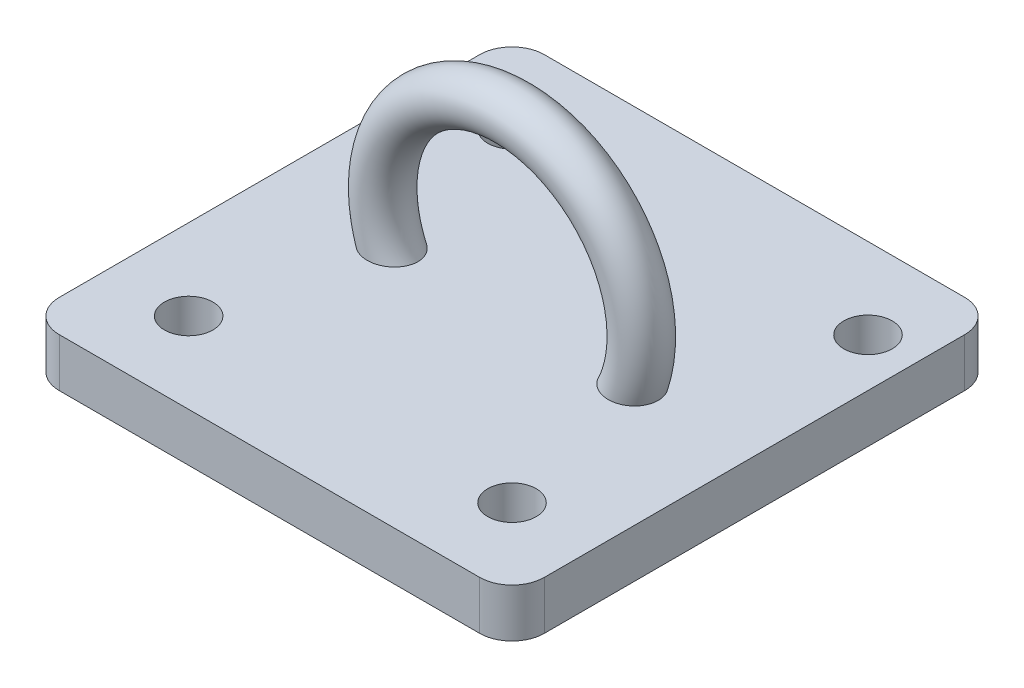
ISO-10303-21;
HEADER;
FILE_DESCRIPTION(('STEP AP214'),'2;1');
FILE_NAME('part.step','',(''),(''),'','','');
FILE_SCHEMA(('AUTOMOTIVE_DESIGN { 1 0 10303 214 1 1 1 1 }'));
ENDSEC;
DATA;
#1=APPLICATION_CONTEXT('core data for automotive mechanical design processes');
#2=APPLICATION_PROTOCOL_DEFINITION('international standard','automotive_design',2000,#1);
#3=PRODUCT_CONTEXT('',#1,'mechanical');
#4=PRODUCT('Part','Part','',(#3));
#5=PRODUCT_RELATED_PRODUCT_CATEGORY('part','',(#4));
#6=PRODUCT_DEFINITION_FORMATION('','',#4);
#7=PRODUCT_DEFINITION_CONTEXT('part definition',#1,'design');
#8=PRODUCT_DEFINITION('design','',#6,#7);
#9=PRODUCT_DEFINITION_SHAPE('','',#8);
#10=(LENGTH_UNIT() NAMED_UNIT(*) SI_UNIT(.MILLI.,.METRE.));
#11=(NAMED_UNIT(*) PLANE_ANGLE_UNIT() SI_UNIT($,.RADIAN.));
#12=(NAMED_UNIT(*) SI_UNIT($,.STERADIAN.) SOLID_ANGLE_UNIT());
#13=UNCERTAINTY_MEASURE_WITH_UNIT(LENGTH_MEASURE(1.E-05),#10,'distance_accuracy_value','');
#14=(GEOMETRIC_REPRESENTATION_CONTEXT(3) GLOBAL_UNCERTAINTY_ASSIGNED_CONTEXT((#13)) GLOBAL_UNIT_ASSIGNED_CONTEXT((#10,
#11,#12)) REPRESENTATION_CONTEXT('',''));
#15=CARTESIAN_POINT('',(0.,0.,0.));
#16=DIRECTION('',(0.,0.,1.));
#17=DIRECTION('',(1.,0.,0.));
#18=AXIS2_PLACEMENT_3D('',#15,#16,#17);
#19=CARTESIAN_POINT('',(15.,3.,-15.));
#20=DIRECTION('',(-1.,0.,0.));
#21=DIRECTION('',(0.,0.,1.));
#22=AXIS2_PLACEMENT_3D('',#19,#20,#21);
#23=PLANE('',#22);
#24=DIRECTION('',(0.,0.,-1.));
#25=VECTOR('',#24,1.);
#26=CARTESIAN_POINT('',(15.,3.,-15.));
#27=LINE('',#26,#25);
#28=CARTESIAN_POINT('',(15.,3.,13.));
#29=VERTEX_POINT('',#28);
#30=CARTESIAN_POINT('',(15.,3.,-13.));
#31=VERTEX_POINT('',#30);
#32=EDGE_CURVE('E143',#29,#31,#27,.T.);
#33=ORIENTED_EDGE('',*,*,#32,.F.);
#34=DIRECTION('',(0.,-1.,0.));
#35=VECTOR('',#34,1.);
#36=CARTESIAN_POINT('',(15.,3.,13.));
#37=LINE('',#36,#35);
#38=CARTESIAN_POINT('',(15.,0.,13.));
#39=VERTEX_POINT('',#38);
#40=EDGE_CURVE('E12',#29,#39,#37,.T.);
#41=ORIENTED_EDGE('',*,*,#40,.T.);
#42=DIRECTION('',(0.,0.,-1.));
#43=VECTOR('',#42,1.);
#44=CARTESIAN_POINT('',(15.,0.,-15.));
#45=LINE('',#44,#43);
#46=CARTESIAN_POINT('',(15.,0.,-13.));
#47=VERTEX_POINT('',#46);
#48=EDGE_CURVE('E233',#39,#47,#45,.T.);
#49=ORIENTED_EDGE('',*,*,#48,.T.);
#50=DIRECTION('',(0.,-1.,0.));
#51=VECTOR('',#50,1.);
#52=CARTESIAN_POINT('',(15.,3.,-13.));
#53=LINE('',#52,#51);
#54=EDGE_CURVE('E57',#47,#31,#53,.F.);
#55=ORIENTED_EDGE('',*,*,#54,.T.);
#56=EDGE_LOOP('',(#33,#41,#49,#55));
#57=FACE_BOUND('',#56,.T.);
#58=ADVANCED_FACE('F49',(#57),#23,.F.);
#59=CARTESIAN_POINT('',(-15.,3.,-15.));
#60=DIRECTION('',(0.,0.,1.));
#61=DIRECTION('',(1.,0.,0.));
#62=AXIS2_PLACEMENT_3D('',#59,#60,#61);
#63=PLANE('',#62);
#64=DIRECTION('',(-1.,0.,0.));
#65=VECTOR('',#64,1.);
#66=CARTESIAN_POINT('',(-15.,0.,-15.));
#67=LINE('',#66,#65);
#68=CARTESIAN_POINT('',(13.,0.,-15.));
#69=VERTEX_POINT('',#68);
#70=CARTESIAN_POINT('',(-13.,0.,-15.));
#71=VERTEX_POINT('',#70);
#72=EDGE_CURVE('E148',#69,#71,#67,.T.);
#73=ORIENTED_EDGE('',*,*,#72,.T.);
#74=DIRECTION('',(0.,-1.,0.));
#75=VECTOR('',#74,1.);
#76=CARTESIAN_POINT('',(-13.,3.,-15.));
#77=LINE('',#76,#75);
#78=CARTESIAN_POINT('',(-13.,3.,-15.));
#79=VERTEX_POINT('',#78);
#80=EDGE_CURVE('E64',#71,#79,#77,.F.);
#81=ORIENTED_EDGE('',*,*,#80,.T.);
#82=DIRECTION('',(-1.,0.,0.));
#83=VECTOR('',#82,1.);
#84=CARTESIAN_POINT('',(-15.,3.,-15.));
#85=LINE('',#84,#83);
#86=CARTESIAN_POINT('',(13.,3.,-15.));
#87=VERTEX_POINT('',#86);
#88=EDGE_CURVE('E146',#87,#79,#85,.T.);
#89=ORIENTED_EDGE('',*,*,#88,.F.);
#90=DIRECTION('',(0.,-1.,0.));
#91=VECTOR('',#90,1.);
#92=CARTESIAN_POINT('',(13.,3.,-15.));
#93=LINE('',#92,#91);
#94=EDGE_CURVE('E228',#87,#69,#93,.T.);
#95=ORIENTED_EDGE('',*,*,#94,.T.);
#96=EDGE_LOOP('',(#73,#81,#89,#95));
#97=FACE_BOUND('',#96,.T.);
#98=ADVANCED_FACE('F194',(#97),#63,.F.);
#99=CARTESIAN_POINT('',(-15.,3.,-15.));
#100=DIRECTION('',(1.,0.,0.));
#101=DIRECTION('',(0.,0.,-1.));
#102=AXIS2_PLACEMENT_3D('',#99,#100,#101);
#103=PLANE('',#102);
#104=DIRECTION('',(0.,0.,1.));
#105=VECTOR('',#104,1.);
#106=CARTESIAN_POINT('',(-15.,0.,-15.));
#107=LINE('',#106,#105);
#108=CARTESIAN_POINT('',(-15.,0.,-13.));
#109=VERTEX_POINT('',#108);
#110=CARTESIAN_POINT('',(-15.,0.,13.));
#111=VERTEX_POINT('',#110);
#112=EDGE_CURVE('E144',#109,#111,#107,.T.);
#113=ORIENTED_EDGE('',*,*,#112,.T.);
#114=DIRECTION('',(0.,-1.,0.));
#115=VECTOR('',#114,1.);
#116=CARTESIAN_POINT('',(-15.,3.,13.));
#117=LINE('',#116,#115);
#118=CARTESIAN_POINT('',(-15.,3.,13.));
#119=VERTEX_POINT('',#118);
#120=EDGE_CURVE('E121',#111,#119,#117,.F.);
#121=ORIENTED_EDGE('',*,*,#120,.T.);
#122=DIRECTION('',(0.,0.,1.));
#123=VECTOR('',#122,1.);
#124=CARTESIAN_POINT('',(-15.,3.,-15.));
#125=LINE('',#124,#123);
#126=CARTESIAN_POINT('',(-15.,3.,-13.));
#127=VERTEX_POINT('',#126);
#128=EDGE_CURVE('E241',#127,#119,#125,.T.);
#129=ORIENTED_EDGE('',*,*,#128,.F.);
#130=DIRECTION('',(0.,-1.,0.));
#131=VECTOR('',#130,1.);
#132=CARTESIAN_POINT('',(-15.,3.,-13.));
#133=LINE('',#132,#131);
#134=EDGE_CURVE('E126',#127,#109,#133,.T.);
#135=ORIENTED_EDGE('',*,*,#134,.T.);
#136=EDGE_LOOP('',(#113,#121,#129,#135));
#137=FACE_BOUND('',#136,.T.);
#138=ADVANCED_FACE('F200',(#137),#103,.F.);
#139=CARTESIAN_POINT('',(-15.,3.,15.));
#140=DIRECTION('',(0.,0.,-1.));
#141=DIRECTION('',(-1.,0.,0.));
#142=AXIS2_PLACEMENT_3D('',#139,#140,#141);
#143=PLANE('',#142);
#144=DIRECTION('',(1.,0.,0.));
#145=VECTOR('',#144,1.);
#146=CARTESIAN_POINT('',(-15.,3.,15.));
#147=LINE('',#146,#145);
#148=CARTESIAN_POINT('',(-13.,3.,15.));
#149=VERTEX_POINT('',#148);
#150=CARTESIAN_POINT('',(13.,3.,15.));
#151=VERTEX_POINT('',#150);
#152=EDGE_CURVE('E136',#149,#151,#147,.T.);
#153=ORIENTED_EDGE('',*,*,#152,.F.);
#154=DIRECTION('',(0.,-1.,0.));
#155=VECTOR('',#154,1.);
#156=CARTESIAN_POINT('',(-13.,3.,15.));
#157=LINE('',#156,#155);
#158=CARTESIAN_POINT('',(-13.,0.,15.));
#159=VERTEX_POINT('',#158);
#160=EDGE_CURVE('E120',#149,#159,#157,.T.);
#161=ORIENTED_EDGE('',*,*,#160,.T.);
#162=DIRECTION('',(1.,0.,0.));
#163=VECTOR('',#162,1.);
#164=CARTESIAN_POINT('',(-15.,0.,15.));
#165=LINE('',#164,#163);
#166=CARTESIAN_POINT('',(13.,0.,15.));
#167=VERTEX_POINT('',#166);
#168=EDGE_CURVE('E133',#159,#167,#165,.T.);
#169=ORIENTED_EDGE('',*,*,#168,.T.);
#170=DIRECTION('',(0.,-1.,0.));
#171=VECTOR('',#170,1.);
#172=CARTESIAN_POINT('',(13.,3.,15.));
#173=LINE('',#172,#171);
#174=EDGE_CURVE('E138',#167,#151,#173,.F.);
#175=ORIENTED_EDGE('',*,*,#174,.T.);
#176=EDGE_LOOP('',(#153,#161,#169,#175));
#177=FACE_BOUND('',#176,.T.);
#178=ADVANCED_FACE('F132',(#177),#143,.F.);
#179=CARTESIAN_POINT('',(0.,3.,0.));
#180=DIRECTION('',(0.,1.,0.));
#181=DIRECTION('',(0.,0.,1.));
#182=AXIS2_PLACEMENT_3D('',#179,#180,#181);
#183=PLANE('',#182);
#184=CARTESIAN_POINT('',(-10.,3.,10.));
#185=DIRECTION('',(0.,1.,0.));
#186=DIRECTION('',(0.,0.,1.));
#187=AXIS2_PLACEMENT_3D('',#184,#185,#186);
#188=CIRCLE('',#187,1.5);
#189=CARTESIAN_POINT('',(-10.,3.,11.5));
#190=VERTEX_POINT('',#189);
#191=EDGE_CURVE('E253',#190,#190,#188,.T.);
#192=ORIENTED_EDGE('',*,*,#191,.F.);
#193=EDGE_LOOP('',(#192));
#194=FACE_BOUND('',#193,.T.);
#195=CARTESIAN_POINT('',(10.,3.,10.));
#196=DIRECTION('',(0.,1.,0.));
#197=DIRECTION('',(0.,0.,1.));
#198=AXIS2_PLACEMENT_3D('',#195,#196,#197);
#199=CIRCLE('',#198,1.5);
#200=CARTESIAN_POINT('',(10.,3.,11.5));
#201=VERTEX_POINT('',#200);
#202=EDGE_CURVE('E259',#201,#201,#199,.T.);
#203=ORIENTED_EDGE('',*,*,#202,.F.);
#204=EDGE_LOOP('',(#203));
#205=FACE_BOUND('',#204,.T.);
#206=CARTESIAN_POINT('',(12.0194606794204,3.,-10.));
#207=DIRECTION('',(0.,1.,0.));
#208=DIRECTION('',(0.,0.,1.));
#209=AXIS2_PLACEMENT_3D('',#206,#207,#208);
#210=CIRCLE('',#209,1.5);
#211=CARTESIAN_POINT('',(12.0194606794204,3.,-8.5));
#212=VERTEX_POINT('',#211);
#213=EDGE_CURVE('E247',#212,#212,#210,.T.);
#214=ORIENTED_EDGE('',*,*,#213,.F.);
#215=EDGE_LOOP('',(#214));
#216=FACE_BOUND('',#215,.T.);
#217=CARTESIAN_POINT('',(-10.,3.,-10.));
#218=DIRECTION('',(0.,1.,0.));
#219=DIRECTION('',(0.,0.,1.));
#220=AXIS2_PLACEMENT_3D('',#217,#218,#219);
#221=CIRCLE('',#220,1.5);
#222=CARTESIAN_POINT('',(-10.,3.,-8.5));
#223=VERTEX_POINT('',#222);
#224=EDGE_CURVE('E244',#223,#223,#221,.T.);
#225=ORIENTED_EDGE('',*,*,#224,.F.);
#226=EDGE_LOOP('',(#225));
#227=FACE_BOUND('',#226,.T.);
#228=CARTESIAN_POINT('',(-8.69608012168817,3.,-0.943129088256091));
#229=CARTESIAN_POINT('',(-8.74944137694281,3.,-0.880516753996925));
#230=CARTESIAN_POINT('',(-8.79770056989678,3.,-0.813497678513805));
#231=CARTESIAN_POINT('',(-8.88241366882919,3.,-0.672311452328189));
#232=CARTESIAN_POINT('',(-8.91885915499619,3.,-0.598139252121139));
#233=CARTESIAN_POINT('',(-8.9786868923998,3.,-0.444605705496286));
#234=CARTESIAN_POINT('',(-9.0020570891535,3.,-0.365239645742541));
#235=CARTESIAN_POINT('',(-9.03483151329056,3.,-0.203684792598687));
#236=CARTESIAN_POINT('',(-9.04423870066794,3.,-0.121496601248121));
#237=CARTESIAN_POINT('',(-9.04870866346765,3.,0.0416636196542305));
#238=CARTESIAN_POINT('',(-9.04404686004298,3.,0.122628214232583));
#239=CARTESIAN_POINT('',(-9.02114155299129,3.,0.282607431540157));
#240=CARTESIAN_POINT('',(-9.00289850091842,3.,0.361622119010339));
#241=CARTESIAN_POINT('',(-8.95355106908772,3.,0.515228035052492));
#242=CARTESIAN_POINT('',(-8.92248945146109,3.,0.589833036955845));
#243=CARTESIAN_POINT('',(-8.84855013792564,3.,0.732927594022279));
#244=CARTESIAN_POINT('',(-8.80567161324676,3.,0.801416719806666));
#245=CARTESIAN_POINT('',(-8.70836344303619,3.,0.932065535507535));
#246=CARTESIAN_POINT('',(-8.65369322374015,3.,0.994045804920255));
#247=CARTESIAN_POINT('',(-8.53511588377166,3.,1.10841602320862));
#248=CARTESIAN_POINT('',(-8.47120715976948,3.,1.16080430382344));
#249=CARTESIAN_POINT('',(-8.33302652849293,3.,1.25699150823459));
#250=CARTESIAN_POINT('',(-8.25842360238873,3.,1.30031449785639));
#251=CARTESIAN_POINT('',(-8.1032954081694,3.,1.37457011477381));
#252=CARTESIAN_POINT('',(-8.02276869634852,3.,1.40549970971354));
#253=CARTESIAN_POINT('',(-7.85334412458758,3.,1.45589437516791));
#254=CARTESIAN_POINT('',(-7.76422959344845,3.,1.47463100124375));
#255=CARTESIAN_POINT('',(-7.58415586704,3.,1.4976818816823));
#256=CARTESIAN_POINT('',(-7.49319617709611,3.,1.50199221563883));
#257=CARTESIAN_POINT('',(-7.30702982356457,3.,1.49617348712953));
#258=CARTESIAN_POINT('',(-7.21184635941696,3.,1.48528741902359));
#259=CARTESIAN_POINT('',(-7.0245215095564,3.,1.44811105528559));
#260=CARTESIAN_POINT('',(-6.93238086561499,3.,1.42181703239701));
#261=CARTESIAN_POINT('',(-6.75141947125446,3.,1.353581135723));
#262=CARTESIAN_POINT('',(-6.66273964788669,3.,1.31126388173906));
#263=CARTESIAN_POINT('',(-6.49398243097908,3.,1.21194053052912));
#264=CARTESIAN_POINT('',(-6.41390528966361,3.,1.15493400279074));
#265=CARTESIAN_POINT('',(-6.26735279859275,3.,1.02921841183056));
#266=CARTESIAN_POINT('',(-6.20055952572047,3.,0.960881473325422));
#267=CARTESIAN_POINT('',(-6.08071045557267,3.,0.813047461812889));
#268=CARTESIAN_POINT('',(-6.02764569622951,3.,0.733557721976706));
#269=CARTESIAN_POINT('',(-5.94192338042827,3.,0.573009187298899));
#270=CARTESIAN_POINT('',(-5.90789586944894,3.,0.492683304220522));
#271=CARTESIAN_POINT('',(-5.85546976745931,3.,0.327092976364164));
#272=CARTESIAN_POINT('',(-5.83705854984367,3.,0.241832581107481));
#273=CARTESIAN_POINT('',(-5.817935416578,3.,0.0777336708324123));
#274=CARTESIAN_POINT('',(-5.81568363775006,3.,-0.000928221887276526));
#275=CARTESIAN_POINT('',(-5.82492883229918,3.,-0.157428831364323));
#276=CARTESIAN_POINT('',(-5.8364229687866,3.,-0.235267714630595));
#277=CARTESIAN_POINT('',(-5.87194846862219,3.,-0.385237076182042));
#278=CARTESIAN_POINT('',(-5.89554605437152,3.,-0.457471463663605));
#279=CARTESIAN_POINT('',(-5.95397219828727,3.,-0.597229525106582));
#280=CARTESIAN_POINT('',(-5.98880259953095,3.,-0.664752423795154));
#281=CARTESIAN_POINT('',(-6.07033940648274,3.,-0.796849585823313));
#282=CARTESIAN_POINT('',(-6.11754782280501,3.,-0.861113024485987));
#283=CARTESIAN_POINT('',(-6.22122252341281,3.,-0.981664554827868));
#284=CARTESIAN_POINT('',(-6.27769219855889,3.,-1.0379497112632));
#285=CARTESIAN_POINT('',(-6.40389846970997,3.,-1.14649706963894));
#286=CARTESIAN_POINT('',(-6.47438184999092,3.,-1.19789107076113));
#287=CARTESIAN_POINT('',(-6.62242274071125,3.,-1.28920846875879));
#288=CARTESIAN_POINT('',(-6.69998307796529,3.,-1.32912725532463));
#289=CARTESIAN_POINT('',(-6.86699384066808,3.,-1.39969159680053));
#290=CARTESIAN_POINT('',(-6.95689548518796,3.,-1.42927263450408));
#291=CARTESIAN_POINT('',(-7.14030156813995,3.,-1.47353568133761));
#292=CARTESIAN_POINT('',(-7.23380679734332,3.,-1.48821440075411));
#293=CARTESIAN_POINT('',(-7.42543807017817,3.,-1.50247686424678));
#294=CARTESIAN_POINT('',(-7.5236077168351,3.,-1.50148656668048));
#295=CARTESIAN_POINT('',(-7.71837915911168,3.,-1.48274872961442));
#296=CARTESIAN_POINT('',(-7.81498058423991,3.,-1.46499728726176));
#297=CARTESIAN_POINT('',(-8.00202370440979,3.,-1.41329159368404));
#298=CARTESIAN_POINT('',(-8.09254122421379,3.,-1.37961229922627));
#299=CARTESIAN_POINT('',(-8.26609208045698,3.,-1.29674728090912));
#300=CARTESIAN_POINT('',(-8.34913689522975,3.,-1.24758587953253));
#301=CARTESIAN_POINT('',(-8.47651158393237,3.,-1.15543905416984));
#302=CARTESIAN_POINT('',(-8.52395438706939,3.,-1.11668677385847));
#303=CARTESIAN_POINT('',(-8.61389833481782,3.,-1.03381134110981));
#304=CARTESIAN_POINT('',(-8.65639985723705,3.,-0.989688599823983));
#305=CARTESIAN_POINT('',(-8.69608012168817,3.,-0.943129088256091));
#306=B_SPLINE_CURVE_WITH_KNOTS('',3,(#228,#229,#230,#231,#232,#233,#234,#235,#236,#237,#238,
#239,#240,#241,#242,#243,#244,#245,#246,#247,#248,#249,#250,#251,#252,#253,#254,#255,#256,#257,
#258,#259,#260,#261,#262,#263,#264,#265,#266,#267,#268,#269,#270,#271,#272,#273,#274,#275,#276,
#277,#278,#279,#280,#281,#282,#283,#284,#285,#286,#287,#288,#289,#290,#291,#292,#293,#294,#295,
#296,#297,#298,#299,#300,#301,#302,#303,#304,#305),.UNSPECIFIED.,.T.,.F.,(4,2,2,2,2,2,2,2,2,2,2,
2,2,2,2,2,2,2,2,2,2,2,2,2,2,2,2,2,2,2,2,2,2,2,2,2,2,2,4),(0.,0.246586399992998,
0.493348161467539,0.740337046360963,0.987273565029328,1.22940750223444,1.47153338924473,
1.712858002505,1.95419954519794,2.20103105697269,2.44790545755887,2.70557827746504,
2.96331410507014,3.23530048602439,3.50736077443459,3.79346771340662,4.07964389157701,
4.37298680800501,4.66633832268806,4.95148071006957,5.23643648215904,5.49669848765623,
5.75674985630595,5.99164502481967,6.22649172390301,6.45345550803749,6.68045655128994,
6.91868045550333,7.15699177707936,7.41758513619712,7.67828304606671,7.96094314818184,
8.24366563446218,8.5367690256869,8.82994068322701,9.11822651311966,9.40606168474523,
9.58944122092093,9.7728067267562),.UNSPECIFIED.);
#307=CARTESIAN_POINT('',(-8.69608012168817,3.,-0.943129088256091));
#308=VERTEX_POINT('',#307);
#309=EDGE_CURVE('E160',#308,#308,#306,.T.);
#310=ORIENTED_EDGE('',*,*,#309,.F.);
#311=EDGE_LOOP('',(#310));
#312=FACE_BOUND('',#311,.T.);
#313=CARTESIAN_POINT('',(5.84429319088407,3.,-0.264876566729818));
#314=CARTESIAN_POINT('',(5.82929071807599,3.,-0.189938880549931));
#315=CARTESIAN_POINT('',(5.8206105295888,3.,-0.11368719013297));
#316=CARTESIAN_POINT('',(5.81636212432465,3.,0.0392207202912573));
#317=CARTESIAN_POINT('',(5.82080374009318,3.,0.115877200664499));
#318=CARTESIAN_POINT('',(5.84257214476422,3.,0.267233763079747));
#319=CARTESIAN_POINT('',(5.85988311153352,3.,0.341936130945983));
#320=CARTESIAN_POINT('',(5.90654648081539,3.,0.487454311885022));
#321=CARTESIAN_POINT('',(5.93589941654219,3.,0.558269952697438));
#322=CARTESIAN_POINT('',(6.00614293410347,3.,0.695788966169413));
#323=CARTESIAN_POINT('',(6.04726339714189,3.,0.762374383147534));
#324=CARTESIAN_POINT('',(6.13924308338142,3.,0.888421360769656));
#325=CARTESIAN_POINT('',(6.19010521678308,3.,0.94788078396216));
#326=CARTESIAN_POINT('',(6.30482317848398,3.,1.06353254172516));
#327=CARTESIAN_POINT('',(6.36942690718662,3.,1.11898254765009));
#328=CARTESIAN_POINT('',(6.50635536772699,3.,1.21934291559553));
#329=CARTESIAN_POINT('',(6.57868331620745,3.,1.26424886159534));
#330=CARTESIAN_POINT('',(6.73608846863026,3.,1.34640677900542));
#331=CARTESIAN_POINT('',(6.82172679048312,3.,1.38258611613086));
#332=CARTESIAN_POINT('',(6.99767595745353,3.,1.44085937601498));
#333=CARTESIAN_POINT('',(7.08798823543131,3.,1.46294895139337));
#334=CARTESIAN_POINT('',(7.27567085986353,3.,1.49327221585307));
#335=CARTESIAN_POINT('',(7.37316608513781,3.,1.50074045473675));
#336=CARTESIAN_POINT('',(7.56803706774156,3.,1.49914366943903));
#337=CARTESIAN_POINT('',(7.66541281799558,3.,1.49007770929524));
#338=CARTESIAN_POINT('',(7.85675749253373,3.,1.45540431450746));
#339=CARTESIAN_POINT('',(7.95073942910587,3.,1.42986923543004));
#340=CARTESIAN_POINT('',(8.13275158212032,3.,1.36264203663141));
#341=CARTESIAN_POINT('',(8.22078315690694,3.,1.32095361911161));
#342=CARTESIAN_POINT('',(8.38405596796867,3.,1.2245073182217));
#343=CARTESIAN_POINT('',(8.45969503655883,3.,1.17042381913167));
#344=CARTESIAN_POINT('',(8.60008760950888,3.,1.04959570590483));
#345=CARTESIAN_POINT('',(8.66484505519047,3.,0.982855694678525));
#346=CARTESIAN_POINT('',(8.7775835469606,3.,0.842847246448659));
#347=CARTESIAN_POINT('',(8.82632610090863,3.,0.770191785670603));
#348=CARTESIAN_POINT('',(8.91017993630591,3.,0.617397947041418));
#349=CARTESIAN_POINT('',(8.94529558955997,3.,0.537261979351346));
#350=CARTESIAN_POINT('',(8.99917888770328,3.,0.376051702703136));
#351=CARTESIAN_POINT('',(9.01866521752419,3.,0.295217106310556));
#352=CARTESIAN_POINT('',(9.04337951802052,3.,0.131400110951486));
#353=CARTESIAN_POINT('',(9.0486101710325,3.,0.0484181190039465));
#354=CARTESIAN_POINT('',(9.04467731155381,3.,-0.114996136286639));
#355=CARTESIAN_POINT('',(9.03589093496273,3.,-0.195437776468813));
#356=CARTESIAN_POINT('',(9.00493998516249,3.,-0.353697855166241));
#357=CARTESIAN_POINT('',(8.98277594152032,3.,-0.431516397390446));
#358=CARTESIAN_POINT('',(8.92581455441913,3.,-0.582432980479098));
#359=CARTESIAN_POINT('',(8.89100860009713,3.,-0.655527763751304));
#360=CARTESIAN_POINT('',(8.80992023647725,3.,-0.795036642691013));
#361=CARTESIAN_POINT('',(8.76363679267785,3.,-0.861450135394288));
#362=CARTESIAN_POINT('',(8.65968761221627,3.,-0.987643597708314));
#363=CARTESIAN_POINT('',(8.60175423827131,3.,-1.04720283209905));
#364=CARTESIAN_POINT('',(8.47710225488768,3.,-1.15626594941524));
#365=CARTESIAN_POINT('',(8.41038201709155,3.,-1.2057679642304));
#366=CARTESIAN_POINT('',(8.26679822101567,3.,-1.29578756635889));
#367=CARTESIAN_POINT('',(8.18960846517109,3.,-1.33578446003671));
#368=CARTESIAN_POINT('',(8.0298694879739,3.,-1.40302910558813));
#369=CARTESIAN_POINT('',(7.947318905525,3.,-1.43027360514549));
#370=CARTESIAN_POINT('',(7.77429400505469,3.,-1.47283022946329));
#371=CARTESIAN_POINT('',(7.68363468575677,3.,-1.48739042273697));
#372=CARTESIAN_POINT('',(7.50115448263408,3.,-1.50186315295696));
#373=CARTESIAN_POINT('',(7.40933329365826,3.,-1.50177175850181));
#374=CARTESIAN_POINT('',(7.22233854060542,3.,-1.48678551236227));
#375=CARTESIAN_POINT('',(7.12722292884975,3.,-1.47116093243841));
#376=CARTESIAN_POINT('',(6.94083946456298,3.,-1.42448368616741));
#377=CARTESIAN_POINT('',(6.84957237891049,3.,-1.39342796053818));
#378=CARTESIAN_POINT('',(6.67181905797614,3.,-1.31584900793365));
#379=CARTESIAN_POINT('',(6.58545277933041,3.,-1.26904977899169));
#380=CARTESIAN_POINT('',(6.4221478096775,3.,-1.161070767696));
#381=CARTESIAN_POINT('',(6.34521129438108,3.,-1.09988767604874));
#382=CARTESIAN_POINT('',(6.20637963428761,3.,-0.966997651787236));
#383=CARTESIAN_POINT('',(6.1440341614826,3.,-0.895762451128492));
#384=CARTESIAN_POINT('',(6.03373857555757,3.,-0.743003643191521));
#385=CARTESIAN_POINT('',(5.98575633195403,3.,-0.66150358796102));
#386=CARTESIAN_POINT('',(5.92325770321633,3.,-0.52649206660401));
#387=CARTESIAN_POINT('',(5.90313532191515,3.,-0.475515844669882));
#388=CARTESIAN_POINT('',(5.86902566790769,3.,-0.371543174948589));
#389=CARTESIAN_POINT('',(5.85503794924516,3.,-0.318546874314567));
#390=CARTESIAN_POINT('',(5.84429319088407,3.,-0.264876566729818));
#391=B_SPLINE_CURVE_WITH_KNOTS('',3,(#313,#314,#315,#316,#317,#318,#319,#320,#321,#322,#323,
#324,#325,#326,#327,#328,#329,#330,#331,#332,#333,#334,#335,#336,#337,#338,#339,#340,#341,#342,
#343,#344,#345,#346,#347,#348,#349,#350,#351,#352,#353,#354,#355,#356,#357,#358,#359,#360,#361,
#362,#363,#364,#365,#366,#367,#368,#369,#370,#371,#372,#373,#374,#375,#376,#377,#378,#379,#380,
#381,#382,#383,#384,#385,#386,#387,#388,#389,#390),.UNSPECIFIED.,.T.,.F.,(4,2,2,2,2,2,2,2,2,2,2,
2,2,2,2,2,2,2,2,2,2,2,2,2,2,2,2,2,2,2,2,2,2,2,2,2,2,2,4),(0.,0.229072915418718,
0.458317525291566,0.687280757124036,0.916254128464115,1.15004783630268,1.38391149629277,
1.63825912346115,1.89271308622462,2.17039074004399,2.44815402960207,2.74010643591295,
3.03207536948055,3.32277022237842,3.6133984899734,3.89091671654589,4.16833420838947,
4.42947130630396,4.69052455638308,4.93874683691037,5.18692240890946,5.42853251350604,
5.67013305437633,5.91189846767892,6.15368567996913,6.40183991679931,6.65004020577177,
6.90970650608965,7.16943899455939,7.44368667683857,7.71800794701573,8.00585585044578,
8.29376084357753,8.58700177178157,8.88031023202825,9.16279376292517,9.4446405741428,
9.60871433203635,9.7727761606915),.UNSPECIFIED.);
#392=CARTESIAN_POINT('',(5.84429319088407,3.,-0.264876566729818));
#393=VERTEX_POINT('',#392);
#394=EDGE_CURVE('E152',#393,#393,#391,.T.);
#395=ORIENTED_EDGE('',*,*,#394,.F.);
#396=EDGE_LOOP('',(#395));
#397=FACE_BOUND('',#396,.T.);
#398=ORIENTED_EDGE('',*,*,#128,.T.);
#399=CARTESIAN_POINT('',(-13.,3.,13.));
#400=DIRECTION('',(0.,1.,0.));
#401=DIRECTION('',(0.,0.,1.));
#402=AXIS2_PLACEMENT_3D('',#399,#400,#401);
#403=CIRCLE('',#402,2.);
#404=EDGE_CURVE('E222',#119,#149,#403,.T.);
#405=ORIENTED_EDGE('',*,*,#404,.T.);
#406=ORIENTED_EDGE('',*,*,#152,.T.);
#407=CARTESIAN_POINT('',(13.,3.,13.));
#408=DIRECTION('',(0.,1.,0.));
#409=DIRECTION('',(0.,0.,1.));
#410=AXIS2_PLACEMENT_3D('',#407,#408,#409);
#411=CIRCLE('',#410,2.);
#412=EDGE_CURVE('E219',#151,#29,#411,.T.);
#413=ORIENTED_EDGE('',*,*,#412,.T.);
#414=ORIENTED_EDGE('',*,*,#32,.T.);
#415=CARTESIAN_POINT('',(13.,3.,-13.));
#416=DIRECTION('',(0.,1.,0.));
#417=DIRECTION('',(0.,0.,1.));
#418=AXIS2_PLACEMENT_3D('',#415,#416,#417);
#419=CIRCLE('',#418,2.);
#420=EDGE_CURVE('E71',#31,#87,#419,.T.);
#421=ORIENTED_EDGE('',*,*,#420,.T.);
#422=ORIENTED_EDGE('',*,*,#88,.T.);
#423=CARTESIAN_POINT('',(-13.,3.,-13.));
#424=DIRECTION('',(0.,1.,0.));
#425=DIRECTION('',(0.,0.,1.));
#426=AXIS2_PLACEMENT_3D('',#423,#424,#425);
#427=CIRCLE('',#426,2.);
#428=EDGE_CURVE('E220',#79,#127,#427,.T.);
#429=ORIENTED_EDGE('',*,*,#428,.T.);
#430=EDGE_LOOP('',(#398,#405,#406,#413,#414,#421,#422,#429));
#431=FACE_BOUND('',#430,.T.);
#432=ADVANCED_FACE('F165',(#194,#205,#216,#227,#312,#397,#431),#183,.T.);
#433=CARTESIAN_POINT('',(0.,0.,0.));
#434=DIRECTION('',(0.,1.,0.));
#435=DIRECTION('',(0.,0.,1.));
#436=AXIS2_PLACEMENT_3D('',#433,#434,#435);
#437=PLANE('',#436);
#438=CARTESIAN_POINT('',(-10.,0.,10.));
#439=DIRECTION('',(0.,1.,0.));
#440=DIRECTION('',(0.,0.,1.));
#441=AXIS2_PLACEMENT_3D('',#438,#439,#440);
#442=CIRCLE('',#441,1.5);
#443=CARTESIAN_POINT('',(-10.,0.,11.5));
#444=VERTEX_POINT('',#443);
#445=EDGE_CURVE('E250',#444,#444,#442,.T.);
#446=ORIENTED_EDGE('',*,*,#445,.T.);
#447=EDGE_LOOP('',(#446));
#448=FACE_BOUND('',#447,.T.);
#449=CARTESIAN_POINT('',(10.,0.,10.));
#450=DIRECTION('',(0.,1.,0.));
#451=DIRECTION('',(0.,0.,1.));
#452=AXIS2_PLACEMENT_3D('',#449,#450,#451);
#453=CIRCLE('',#452,1.5);
#454=CARTESIAN_POINT('',(10.,0.,11.5));
#455=VERTEX_POINT('',#454);
#456=EDGE_CURVE('E256',#455,#455,#453,.T.);
#457=ORIENTED_EDGE('',*,*,#456,.T.);
#458=EDGE_LOOP('',(#457));
#459=FACE_BOUND('',#458,.T.);
#460=CARTESIAN_POINT('',(12.0194606794204,0.,-10.));
#461=DIRECTION('',(0.,1.,0.));
#462=DIRECTION('',(0.,0.,1.));
#463=AXIS2_PLACEMENT_3D('',#460,#461,#462);
#464=CIRCLE('',#463,1.5);
#465=CARTESIAN_POINT('',(12.0194606794204,0.,-8.5));
#466=VERTEX_POINT('',#465);
#467=EDGE_CURVE('E262',#466,#466,#464,.T.);
#468=ORIENTED_EDGE('',*,*,#467,.T.);
#469=EDGE_LOOP('',(#468));
#470=FACE_BOUND('',#469,.T.);
#471=CARTESIAN_POINT('',(-10.,0.,-10.));
#472=DIRECTION('',(0.,1.,0.));
#473=DIRECTION('',(0.,0.,1.));
#474=AXIS2_PLACEMENT_3D('',#471,#472,#473);
#475=CIRCLE('',#474,1.5);
#476=CARTESIAN_POINT('',(-10.,0.,-8.5));
#477=VERTEX_POINT('',#476);
#478=EDGE_CURVE('E237',#477,#477,#475,.T.);
#479=ORIENTED_EDGE('',*,*,#478,.T.);
#480=EDGE_LOOP('',(#479));
#481=FACE_BOUND('',#480,.T.);
#482=ORIENTED_EDGE('',*,*,#168,.F.);
#483=CARTESIAN_POINT('',(-13.,0.,13.));
#484=DIRECTION('',(0.,1.,0.));
#485=DIRECTION('',(0.,0.,1.));
#486=AXIS2_PLACEMENT_3D('',#483,#484,#485);
#487=CIRCLE('',#486,2.);
#488=EDGE_CURVE('E116',#159,#111,#487,.F.);
#489=ORIENTED_EDGE('',*,*,#488,.T.);
#490=ORIENTED_EDGE('',*,*,#112,.F.);
#491=CARTESIAN_POINT('',(-13.,0.,-13.));
#492=DIRECTION('',(0.,1.,0.));
#493=DIRECTION('',(0.,0.,1.));
#494=AXIS2_PLACEMENT_3D('',#491,#492,#493);
#495=CIRCLE('',#494,2.);
#496=EDGE_CURVE('E127',#109,#71,#495,.F.);
#497=ORIENTED_EDGE('',*,*,#496,.T.);
#498=ORIENTED_EDGE('',*,*,#72,.F.);
#499=CARTESIAN_POINT('',(13.,0.,-13.));
#500=DIRECTION('',(0.,1.,0.));
#501=DIRECTION('',(0.,0.,1.));
#502=AXIS2_PLACEMENT_3D('',#499,#500,#501);
#503=CIRCLE('',#502,2.);
#504=EDGE_CURVE('E137',#69,#47,#503,.F.);
#505=ORIENTED_EDGE('',*,*,#504,.T.);
#506=ORIENTED_EDGE('',*,*,#48,.F.);
#507=CARTESIAN_POINT('',(13.,0.,13.));
#508=DIRECTION('',(0.,1.,0.));
#509=DIRECTION('',(0.,0.,1.));
#510=AXIS2_PLACEMENT_3D('',#507,#508,#509);
#511=CIRCLE('',#510,2.);
#512=EDGE_CURVE('E142',#39,#167,#511,.F.);
#513=ORIENTED_EDGE('',*,*,#512,.T.);
#514=EDGE_LOOP('',(#482,#489,#490,#497,#498,#505,#506,#513));
#515=FACE_BOUND('',#514,.T.);
#516=ADVANCED_FACE('F140',(#448,#459,#470,#481,#515),#437,.F.);
#517=CARTESIAN_POINT('',(0.,5.89848673571018,0.));
#518=DIRECTION('',(0.,0.,1.));
#519=DIRECTION('',(1.,0.,0.));
#520=AXIS2_PLACEMENT_3D('',#517,#518,#519);
#521=TOROIDAL_SURFACE('',#520,8.,1.5);
#522=ORIENTED_EDGE('',*,*,#309,.T.);
#523=EDGE_LOOP('',(#522));
#524=FACE_BOUND('',#523,.T.);
#525=ORIENTED_EDGE('',*,*,#394,.T.);
#526=EDGE_LOOP('',(#525));
#527=FACE_BOUND('',#526,.T.);
#528=ADVANCED_FACE('F168',(#524,#527),#521,.T.);
#529=CARTESIAN_POINT('',(-10.,0.,-10.));
#530=DIRECTION('',(0.,1.,0.));
#531=DIRECTION('',(0.,0.,1.));
#532=AXIS2_PLACEMENT_3D('',#529,#530,#531);
#533=CYLINDRICAL_SURFACE('',#532,1.5);
#534=ORIENTED_EDGE('',*,*,#478,.F.);
#535=EDGE_LOOP('',(#534));
#536=FACE_BOUND('',#535,.T.);
#537=ORIENTED_EDGE('',*,*,#224,.T.);
#538=EDGE_LOOP('',(#537));
#539=FACE_BOUND('',#538,.T.);
#540=ADVANCED_FACE('F172',(#536,#539),#533,.F.);
#541=CARTESIAN_POINT('',(12.0194606794204,0.,-10.));
#542=DIRECTION('',(0.,1.,0.));
#543=DIRECTION('',(0.,0.,1.));
#544=AXIS2_PLACEMENT_3D('',#541,#542,#543);
#545=CYLINDRICAL_SURFACE('',#544,1.5);
#546=ORIENTED_EDGE('',*,*,#467,.F.);
#547=EDGE_LOOP('',(#546));
#548=FACE_BOUND('',#547,.T.);
#549=ORIENTED_EDGE('',*,*,#213,.T.);
#550=EDGE_LOOP('',(#549));
#551=FACE_BOUND('',#550,.T.);
#552=ADVANCED_FACE('F177',(#548,#551),#545,.F.);
#553=CARTESIAN_POINT('',(10.,0.,10.));
#554=DIRECTION('',(0.,1.,0.));
#555=DIRECTION('',(0.,0.,1.));
#556=AXIS2_PLACEMENT_3D('',#553,#554,#555);
#557=CYLINDRICAL_SURFACE('',#556,1.5);
#558=ORIENTED_EDGE('',*,*,#456,.F.);
#559=EDGE_LOOP('',(#558));
#560=FACE_BOUND('',#559,.T.);
#561=ORIENTED_EDGE('',*,*,#202,.T.);
#562=EDGE_LOOP('',(#561));
#563=FACE_BOUND('',#562,.T.);
#564=ADVANCED_FACE('F182',(#560,#563),#557,.F.);
#565=CARTESIAN_POINT('',(-10.,0.,10.));
#566=DIRECTION('',(0.,1.,0.));
#567=DIRECTION('',(0.,0.,1.));
#568=AXIS2_PLACEMENT_3D('',#565,#566,#567);
#569=CYLINDRICAL_SURFACE('',#568,1.5);
#570=ORIENTED_EDGE('',*,*,#445,.F.);
#571=EDGE_LOOP('',(#570));
#572=FACE_BOUND('',#571,.T.);
#573=ORIENTED_EDGE('',*,*,#191,.T.);
#574=EDGE_LOOP('',(#573));
#575=FACE_BOUND('',#574,.T.);
#576=ADVANCED_FACE('F179',(#572,#575),#569,.F.);
#577=CARTESIAN_POINT('',(-13.,3.,13.));
#578=DIRECTION('',(0.,-1.,0.));
#579=DIRECTION('',(0.,0.,-1.));
#580=AXIS2_PLACEMENT_3D('',#577,#578,#579);
#581=CYLINDRICAL_SURFACE('',#580,2.);
#582=ORIENTED_EDGE('',*,*,#404,.F.);
#583=ORIENTED_EDGE('',*,*,#120,.F.);
#584=ORIENTED_EDGE('',*,*,#488,.F.);
#585=ORIENTED_EDGE('',*,*,#160,.F.);
#586=EDGE_LOOP('',(#582,#583,#584,#585));
#587=FACE_BOUND('',#586,.T.);
#588=ADVANCED_FACE('F119',(#587),#581,.T.);
#589=CARTESIAN_POINT('',(-13.,3.,-13.));
#590=DIRECTION('',(0.,-1.,0.));
#591=DIRECTION('',(0.,0.,-1.));
#592=AXIS2_PLACEMENT_3D('',#589,#590,#591);
#593=CYLINDRICAL_SURFACE('',#592,2.);
#594=ORIENTED_EDGE('',*,*,#428,.F.);
#595=ORIENTED_EDGE('',*,*,#80,.F.);
#596=ORIENTED_EDGE('',*,*,#496,.F.);
#597=ORIENTED_EDGE('',*,*,#134,.F.);
#598=EDGE_LOOP('',(#594,#595,#596,#597));
#599=FACE_BOUND('',#598,.T.);
#600=ADVANCED_FACE('F207',(#599),#593,.T.);
#601=CARTESIAN_POINT('',(13.,3.,13.));
#602=DIRECTION('',(0.,-1.,0.));
#603=DIRECTION('',(0.,0.,-1.));
#604=AXIS2_PLACEMENT_3D('',#601,#602,#603);
#605=CYLINDRICAL_SURFACE('',#604,2.);
#606=ORIENTED_EDGE('',*,*,#412,.F.);
#607=ORIENTED_EDGE('',*,*,#174,.F.);
#608=ORIENTED_EDGE('',*,*,#512,.F.);
#609=ORIENTED_EDGE('',*,*,#40,.F.);
#610=EDGE_LOOP('',(#606,#607,#608,#609));
#611=FACE_BOUND('',#610,.T.);
#612=ADVANCED_FACE('F209',(#611),#605,.T.);
#613=CARTESIAN_POINT('',(13.,3.,-13.));
#614=DIRECTION('',(0.,-1.,0.));
#615=DIRECTION('',(0.,0.,-1.));
#616=AXIS2_PLACEMENT_3D('',#613,#614,#615);
#617=CYLINDRICAL_SURFACE('',#616,2.);
#618=ORIENTED_EDGE('',*,*,#420,.F.);
#619=ORIENTED_EDGE('',*,*,#54,.F.);
#620=ORIENTED_EDGE('',*,*,#504,.F.);
#621=ORIENTED_EDGE('',*,*,#94,.F.);
#622=EDGE_LOOP('',(#618,#619,#620,#621));
#623=FACE_BOUND('',#622,.T.);
#624=ADVANCED_FACE('F51',(#623),#617,.T.);
#625=CLOSED_SHELL('',(#58,#98,#138,#178,#432,#516,#528,#540,#552,#564,#576,#588,#600,#612,#624));
#626=MANIFOLD_SOLID_BREP('B2',#625);
#627=ADVANCED_BREP_SHAPE_REPRESENTATION('',(#18,#626),#14);
#628=SHAPE_DEFINITION_REPRESENTATION(#9,#627);
ENDSEC;
END-ISO-10303-21;
